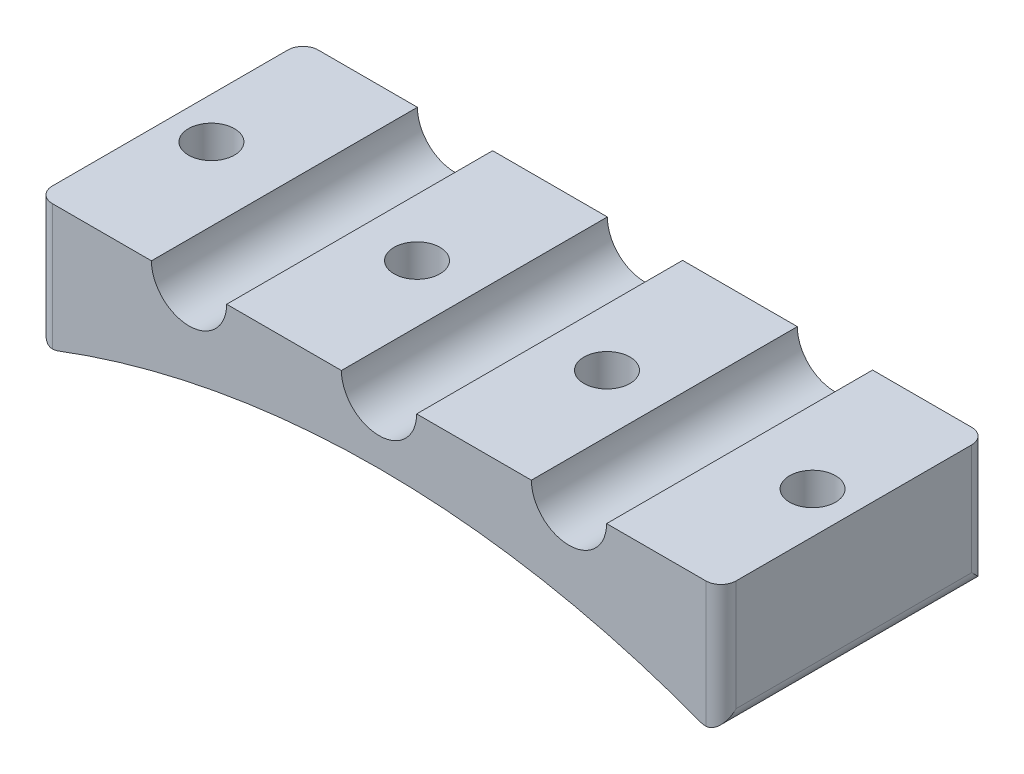
ISO-10303-21;
HEADER;
FILE_DESCRIPTION(('STEP AP214'),'2;1');
FILE_NAME('part.step','',(''),(''),'','','');
FILE_SCHEMA(('AUTOMOTIVE_DESIGN { 1 0 10303 214 1 1 1 1 }'));
ENDSEC;
DATA;
#1=APPLICATION_CONTEXT('core data for automotive mechanical design processes');
#2=APPLICATION_PROTOCOL_DEFINITION('international standard','automotive_design',2000,#1);
#3=PRODUCT_CONTEXT('',#1,'mechanical');
#4=PRODUCT('Part','Part','',(#3));
#5=PRODUCT_RELATED_PRODUCT_CATEGORY('part','',(#4));
#6=PRODUCT_DEFINITION_FORMATION('','',#4);
#7=PRODUCT_DEFINITION_CONTEXT('part definition',#1,'design');
#8=PRODUCT_DEFINITION('design','',#6,#7);
#9=PRODUCT_DEFINITION_SHAPE('','',#8);
#10=(LENGTH_UNIT() NAMED_UNIT(*) SI_UNIT(.MILLI.,.METRE.));
#11=(NAMED_UNIT(*) PLANE_ANGLE_UNIT() SI_UNIT($,.RADIAN.));
#12=(NAMED_UNIT(*) SI_UNIT($,.STERADIAN.) SOLID_ANGLE_UNIT());
#13=UNCERTAINTY_MEASURE_WITH_UNIT(LENGTH_MEASURE(1.E-05),#10,'distance_accuracy_value','');
#14=(GEOMETRIC_REPRESENTATION_CONTEXT(3) GLOBAL_UNCERTAINTY_ASSIGNED_CONTEXT((#13)) GLOBAL_UNIT_ASSIGNED_CONTEXT((#10,
#11,#12)) REPRESENTATION_CONTEXT('',''));
#15=CARTESIAN_POINT('',(0.,0.,0.));
#16=DIRECTION('',(0.,0.,1.));
#17=DIRECTION('',(1.,0.,0.));
#18=AXIS2_PLACEMENT_3D('',#15,#16,#17);
#19=CARTESIAN_POINT('',(0.,0.,0.));
#20=DIRECTION('',(0.,1.,0.));
#21=DIRECTION('',(0.,0.,1.));
#22=AXIS2_PLACEMENT_3D('',#19,#20,#21);
#23=PLANE('',#22);
#24=CARTESIAN_POINT('',(39.5552853917181,0.,17.5));
#25=DIRECTION('',(0.,1.,0.));
#26=DIRECTION('',(0.,0.,1.));
#27=AXIS2_PLACEMENT_3D('',#24,#25,#26);
#28=CIRCLE('',#27,3.025);
#29=CARTESIAN_POINT('',(39.5552853917181,0.,20.525));
#30=VERTEX_POINT('',#29);
#31=EDGE_CURVE('E280',#30,#30,#28,.T.);
#32=ORIENTED_EDGE('',*,*,#31,.F.);
#33=EDGE_LOOP('',(#32));
#34=FACE_BOUND('',#33,.T.);
#35=DIRECTION('',(0.,0.,1.));
#36=VECTOR('',#35,1.);
#37=CARTESIAN_POINT('',(45.,0.,35.));
#38=LINE('',#37,#36);
#39=CARTESIAN_POINT('',(45.,0.,2.));
#40=VERTEX_POINT('',#39);
#41=CARTESIAN_POINT('',(45.,0.,33.));
#42=VERTEX_POINT('',#41);
#43=EDGE_CURVE('E189',#40,#42,#38,.T.);
#44=ORIENTED_EDGE('',*,*,#43,.F.);
#45=CARTESIAN_POINT('',(43.,0.,2.));
#46=DIRECTION('',(0.,1.,0.));
#47=DIRECTION('',(0.,0.,1.));
#48=AXIS2_PLACEMENT_3D('',#45,#46,#47);
#49=CIRCLE('',#48,2.);
#50=CARTESIAN_POINT('',(43.,0.,0.));
#51=VERTEX_POINT('',#50);
#52=EDGE_CURVE('E166',#40,#51,#49,.T.);
#53=ORIENTED_EDGE('',*,*,#52,.T.);
#54=DIRECTION('',(-1.,0.,0.));
#55=VECTOR('',#54,1.);
#56=CARTESIAN_POINT('',(0.,0.,0.));
#57=LINE('',#56,#55);
#58=CARTESIAN_POINT('',(29.95,0.,0.));
#59=VERTEX_POINT('',#58);
#60=EDGE_CURVE('E158',#51,#59,#57,.T.);
#61=ORIENTED_EDGE('',*,*,#60,.T.);
#62=DIRECTION('',(0.,0.,-1.));
#63=VECTOR('',#62,1.);
#64=CARTESIAN_POINT('',(29.95,0.,35.));
#65=LINE('',#64,#63);
#66=CARTESIAN_POINT('',(29.95,0.,35.));
#67=VERTEX_POINT('',#66);
#68=EDGE_CURVE('E163',#67,#59,#65,.T.);
#69=ORIENTED_EDGE('',*,*,#68,.F.);
#70=DIRECTION('',(-1.,0.,0.));
#71=VECTOR('',#70,1.);
#72=CARTESIAN_POINT('',(0.,0.,35.));
#73=LINE('',#72,#71);
#74=CARTESIAN_POINT('',(43.,0.,35.));
#75=VERTEX_POINT('',#74);
#76=EDGE_CURVE('E290',#75,#67,#73,.T.);
#77=ORIENTED_EDGE('',*,*,#76,.F.);
#78=CARTESIAN_POINT('',(43.,0.,33.));
#79=DIRECTION('',(0.,1.,0.));
#80=DIRECTION('',(0.,0.,1.));
#81=AXIS2_PLACEMENT_3D('',#78,#79,#80);
#82=CIRCLE('',#81,2.);
#83=EDGE_CURVE('E247',#75,#42,#82,.T.);
#84=ORIENTED_EDGE('',*,*,#83,.T.);
#85=EDGE_LOOP('',(#44,#53,#61,#69,#77,#84));
#86=FACE_BOUND('',#85,.T.);
#87=ADVANCED_FACE('F45',(#34,#86),#23,.T.);
#88=CARTESIAN_POINT('',(12.5,0.,17.5));
#89=DIRECTION('',(0.,1.,0.));
#90=DIRECTION('',(0.,0.,1.));
#91=AXIS2_PLACEMENT_3D('',#88,#89,#90);
#92=CIRCLE('',#91,3.025);
#93=CARTESIAN_POINT('',(12.5,0.,20.525));
#94=VERTEX_POINT('',#93);
#95=EDGE_CURVE('E274',#94,#94,#92,.T.);
#96=ORIENTED_EDGE('',*,*,#95,.F.);
#97=EDGE_LOOP('',(#96));
#98=FACE_BOUND('',#97,.T.);
#99=CARTESIAN_POINT('',(20.05,0.,35.));
#100=VERTEX_POINT('',#99);
#101=CARTESIAN_POINT('',(4.95,0.,35.));
#102=VERTEX_POINT('',#101);
#103=EDGE_CURVE('E292',#100,#102,#73,.T.);
#104=ORIENTED_EDGE('',*,*,#103,.F.);
#105=DIRECTION('',(0.,0.,-1.));
#106=VECTOR('',#105,1.);
#107=CARTESIAN_POINT('',(20.05,0.,35.));
#108=LINE('',#107,#106);
#109=CARTESIAN_POINT('',(20.05,0.,0.));
#110=VERTEX_POINT('',#109);
#111=EDGE_CURVE('E186',#110,#100,#108,.F.);
#112=ORIENTED_EDGE('',*,*,#111,.F.);
#113=CARTESIAN_POINT('',(4.95,0.,0.));
#114=VERTEX_POINT('',#113);
#115=EDGE_CURVE('E170',#110,#114,#57,.T.);
#116=ORIENTED_EDGE('',*,*,#115,.T.);
#117=DIRECTION('',(0.,0.,-1.));
#118=VECTOR('',#117,1.);
#119=CARTESIAN_POINT('',(4.95,0.,35.));
#120=LINE('',#119,#118);
#121=EDGE_CURVE('E192',#102,#114,#120,.T.);
#122=ORIENTED_EDGE('',*,*,#121,.F.);
#123=EDGE_LOOP('',(#104,#112,#116,#122));
#124=FACE_BOUND('',#123,.T.);
#125=ADVANCED_FACE('F346',(#98,#124),#23,.T.);
#126=CARTESIAN_POINT('',(-12.5,0.,17.5));
#127=DIRECTION('',(0.,1.,0.));
#128=DIRECTION('',(0.,0.,1.));
#129=AXIS2_PLACEMENT_3D('',#126,#127,#128);
#130=CIRCLE('',#129,3.025);
#131=CARTESIAN_POINT('',(-12.5,0.,20.525));
#132=VERTEX_POINT('',#131);
#133=EDGE_CURVE('E266',#132,#132,#130,.T.);
#134=ORIENTED_EDGE('',*,*,#133,.F.);
#135=EDGE_LOOP('',(#134));
#136=FACE_BOUND('',#135,.T.);
#137=CARTESIAN_POINT('',(-4.94999999999999,0.,35.));
#138=VERTEX_POINT('',#137);
#139=CARTESIAN_POINT('',(-20.05,0.,35.));
#140=VERTEX_POINT('',#139);
#141=EDGE_CURVE('E341',#138,#140,#73,.T.);
#142=ORIENTED_EDGE('',*,*,#141,.F.);
#143=DIRECTION('',(0.,0.,-1.));
#144=VECTOR('',#143,1.);
#145=CARTESIAN_POINT('',(-4.94999999999999,0.,35.));
#146=LINE('',#145,#144);
#147=CARTESIAN_POINT('',(-4.94999999999999,0.,0.));
#148=VERTEX_POINT('',#147);
#149=EDGE_CURVE('E187',#148,#138,#146,.F.);
#150=ORIENTED_EDGE('',*,*,#149,.F.);
#151=CARTESIAN_POINT('',(-20.05,0.,0.));
#152=VERTEX_POINT('',#151);
#153=EDGE_CURVE('E201',#148,#152,#57,.T.);
#154=ORIENTED_EDGE('',*,*,#153,.T.);
#155=DIRECTION('',(0.,0.,-1.));
#156=VECTOR('',#155,1.);
#157=CARTESIAN_POINT('',(-20.05,0.,35.));
#158=LINE('',#157,#156);
#159=EDGE_CURVE('E296',#140,#152,#158,.T.);
#160=ORIENTED_EDGE('',*,*,#159,.F.);
#161=EDGE_LOOP('',(#142,#150,#154,#160));
#162=FACE_BOUND('',#161,.T.);
#163=ADVANCED_FACE('F353',(#136,#162),#23,.T.);
#164=CARTESIAN_POINT('',(-39.5552853917181,0.,17.5));
#165=DIRECTION('',(0.,1.,0.));
#166=DIRECTION('',(0.,0.,1.));
#167=AXIS2_PLACEMENT_3D('',#164,#165,#166);
#168=CIRCLE('',#167,3.025);
#169=CARTESIAN_POINT('',(-39.5552853917181,0.,20.525));
#170=VERTEX_POINT('',#169);
#171=EDGE_CURVE('E261',#170,#170,#168,.T.);
#172=ORIENTED_EDGE('',*,*,#171,.F.);
#173=EDGE_LOOP('',(#172));
#174=FACE_BOUND('',#173,.T.);
#175=CARTESIAN_POINT('',(-29.95,0.,0.));
#176=VERTEX_POINT('',#175);
#177=CARTESIAN_POINT('',(-43.,0.,0.));
#178=VERTEX_POINT('',#177);
#179=EDGE_CURVE('E172',#176,#178,#57,.T.);
#180=ORIENTED_EDGE('',*,*,#179,.T.);
#181=CARTESIAN_POINT('',(-43.,0.,2.));
#182=DIRECTION('',(0.,1.,0.));
#183=DIRECTION('',(0.,0.,1.));
#184=AXIS2_PLACEMENT_3D('',#181,#182,#183);
#185=CIRCLE('',#184,2.);
#186=CARTESIAN_POINT('',(-45.,0.,2.));
#187=VERTEX_POINT('',#186);
#188=EDGE_CURVE('E11',#178,#187,#185,.T.);
#189=ORIENTED_EDGE('',*,*,#188,.T.);
#190=DIRECTION('',(0.,0.,1.));
#191=VECTOR('',#190,1.);
#192=CARTESIAN_POINT('',(-45.,0.,35.));
#193=LINE('',#192,#191);
#194=CARTESIAN_POINT('',(-45.,0.,33.));
#195=VERTEX_POINT('',#194);
#196=EDGE_CURVE('E169',#187,#195,#193,.T.);
#197=ORIENTED_EDGE('',*,*,#196,.T.);
#198=CARTESIAN_POINT('',(-43.,0.,33.));
#199=DIRECTION('',(0.,1.,0.));
#200=DIRECTION('',(0.,0.,1.));
#201=AXIS2_PLACEMENT_3D('',#198,#199,#200);
#202=CIRCLE('',#201,2.);
#203=CARTESIAN_POINT('',(-43.,0.,35.));
#204=VERTEX_POINT('',#203);
#205=EDGE_CURVE('E54',#195,#204,#202,.T.);
#206=ORIENTED_EDGE('',*,*,#205,.T.);
#207=CARTESIAN_POINT('',(-29.95,0.,35.));
#208=VERTEX_POINT('',#207);
#209=EDGE_CURVE('E207',#208,#204,#73,.T.);
#210=ORIENTED_EDGE('',*,*,#209,.F.);
#211=DIRECTION('',(0.,0.,-1.));
#212=VECTOR('',#211,1.);
#213=CARTESIAN_POINT('',(-29.95,0.,35.));
#214=LINE('',#213,#212);
#215=EDGE_CURVE('E293',#176,#208,#214,.F.);
#216=ORIENTED_EDGE('',*,*,#215,.F.);
#217=EDGE_LOOP('',(#180,#189,#197,#206,#210,#216));
#218=FACE_BOUND('',#217,.T.);
#219=ADVANCED_FACE('F332',(#174,#218),#23,.T.);
#220=CARTESIAN_POINT('',(-45.,0.,35.));
#221=DIRECTION('',(1.,0.,0.));
#222=DIRECTION('',(0.,0.,-1.));
#223=AXIS2_PLACEMENT_3D('',#220,#221,#222);
#224=PLANE('',#223);
#225=ORIENTED_EDGE('',*,*,#196,.F.);
#226=DIRECTION('',(0.,-1.,0.));
#227=VECTOR('',#226,1.);
#228=CARTESIAN_POINT('',(-45.,0.,2.));
#229=LINE('',#228,#227);
#230=CARTESIAN_POINT('',(-45.,-14.565717740785,2.));
#231=VERTEX_POINT('',#230);
#232=EDGE_CURVE('E62',#187,#231,#229,.T.);
#233=ORIENTED_EDGE('',*,*,#232,.T.);
#234=DIRECTION('',(0.,0.,-1.));
#235=VECTOR('',#234,1.);
#236=CARTESIAN_POINT('',(-45.,-14.565717740785,35.));
#237=LINE('',#236,#235);
#238=CARTESIAN_POINT('',(-45.,-14.565717740785,33.));
#239=VERTEX_POINT('',#238);
#240=EDGE_CURVE('E66',#231,#239,#237,.F.);
#241=ORIENTED_EDGE('',*,*,#240,.T.);
#242=DIRECTION('',(0.,-1.,0.));
#243=VECTOR('',#242,1.);
#244=CARTESIAN_POINT('',(-45.,0.,33.));
#245=LINE('',#244,#243);
#246=EDGE_CURVE('E243',#239,#195,#245,.F.);
#247=ORIENTED_EDGE('',*,*,#246,.T.);
#248=EDGE_LOOP('',(#225,#233,#241,#247));
#249=FACE_BOUND('',#248,.T.);
#250=ADVANCED_FACE('F335',(#249),#224,.F.);
#251=CARTESIAN_POINT('',(0.,0.,35.));
#252=DIRECTION('',(0.,0.,-1.));
#253=DIRECTION('',(-1.,0.,0.));
#254=AXIS2_PLACEMENT_3D('',#251,#252,#253);
#255=CYLINDRICAL_SURFACE('',#254,4.95);
#256=CARTESIAN_POINT('',(0.,0.,35.));
#257=DIRECTION('',(0.,0.,1.));
#258=DIRECTION('',(1.,0.,0.));
#259=AXIS2_PLACEMENT_3D('',#256,#257,#258);
#260=CIRCLE('',#259,4.95);
#261=EDGE_CURVE('E206',#138,#102,#260,.T.);
#262=ORIENTED_EDGE('',*,*,#261,.T.);
#263=ORIENTED_EDGE('',*,*,#121,.T.);
#264=CARTESIAN_POINT('',(0.,0.,0.));
#265=DIRECTION('',(0.,0.,1.));
#266=DIRECTION('',(1.,0.,0.));
#267=AXIS2_PLACEMENT_3D('',#264,#265,#266);
#268=CIRCLE('',#267,4.95);
#269=EDGE_CURVE('E181',#148,#114,#268,.T.);
#270=ORIENTED_EDGE('',*,*,#269,.F.);
#271=ORIENTED_EDGE('',*,*,#149,.T.);
#272=EDGE_LOOP('',(#262,#263,#270,#271));
#273=FACE_BOUND('',#272,.T.);
#274=ADVANCED_FACE('F348',(#273),#255,.F.);
#275=CARTESIAN_POINT('',(25.,0.,35.));
#276=DIRECTION('',(0.,0.,-1.));
#277=DIRECTION('',(-1.,0.,0.));
#278=AXIS2_PLACEMENT_3D('',#275,#276,#277);
#279=CYLINDRICAL_SURFACE('',#278,4.95);
#280=CARTESIAN_POINT('',(25.,0.,35.));
#281=DIRECTION('',(0.,0.,1.));
#282=DIRECTION('',(1.,0.,0.));
#283=AXIS2_PLACEMENT_3D('',#280,#281,#282);
#284=CIRCLE('',#283,4.95);
#285=EDGE_CURVE('E185',#100,#67,#284,.T.);
#286=ORIENTED_EDGE('',*,*,#285,.T.);
#287=ORIENTED_EDGE('',*,*,#68,.T.);
#288=CARTESIAN_POINT('',(25.,0.,0.));
#289=DIRECTION('',(0.,0.,1.));
#290=DIRECTION('',(1.,0.,0.));
#291=AXIS2_PLACEMENT_3D('',#288,#289,#290);
#292=CIRCLE('',#291,4.95);
#293=EDGE_CURVE('E174',#110,#59,#292,.T.);
#294=ORIENTED_EDGE('',*,*,#293,.F.);
#295=ORIENTED_EDGE('',*,*,#111,.T.);
#296=EDGE_LOOP('',(#286,#287,#294,#295));
#297=FACE_BOUND('',#296,.T.);
#298=ADVANCED_FACE('F183',(#297),#279,.F.);
#299=CARTESIAN_POINT('',(45.,0.,35.));
#300=DIRECTION('',(1.,0.,0.));
#301=DIRECTION('',(0.,1.,0.));
#302=AXIS2_PLACEMENT_3D('',#299,#300,#301);
#303=PLANE('',#302);
#304=DIRECTION('',(0.,0.,1.));
#305=VECTOR('',#304,1.);
#306=CARTESIAN_POINT('',(45.,-14.565717740785,0.));
#307=LINE('',#306,#305);
#308=CARTESIAN_POINT('',(45.,-14.565717740785,33.));
#309=VERTEX_POINT('',#308);
#310=CARTESIAN_POINT('',(45.,-14.565717740785,2.));
#311=VERTEX_POINT('',#310);
#312=EDGE_CURVE('E217',#309,#311,#307,.F.);
#313=ORIENTED_EDGE('',*,*,#312,.T.);
#314=DIRECTION('',(0.,-1.,0.));
#315=VECTOR('',#314,1.);
#316=CARTESIAN_POINT('',(45.,0.,2.));
#317=LINE('',#316,#315);
#318=EDGE_CURVE('E220',#311,#40,#317,.F.);
#319=ORIENTED_EDGE('',*,*,#318,.T.);
#320=ORIENTED_EDGE('',*,*,#43,.T.);
#321=DIRECTION('',(0.,-1.,0.));
#322=VECTOR('',#321,1.);
#323=CARTESIAN_POINT('',(45.,0.,33.));
#324=LINE('',#323,#322);
#325=EDGE_CURVE('E215',#42,#309,#324,.T.);
#326=ORIENTED_EDGE('',*,*,#325,.T.);
#327=EDGE_LOOP('',(#313,#319,#320,#326));
#328=FACE_BOUND('',#327,.T.);
#329=ADVANCED_FACE('F301',(#328),#303,.T.);
#330=CARTESIAN_POINT('',(-25.,0.,35.));
#331=DIRECTION('',(0.,0.,-1.));
#332=DIRECTION('',(-1.,0.,0.));
#333=AXIS2_PLACEMENT_3D('',#330,#331,#332);
#334=CYLINDRICAL_SURFACE('',#333,4.95);
#335=CARTESIAN_POINT('',(-25.,0.,35.));
#336=DIRECTION('',(0.,0.,1.));
#337=DIRECTION('',(1.,0.,0.));
#338=AXIS2_PLACEMENT_3D('',#335,#336,#337);
#339=CIRCLE('',#338,4.95);
#340=EDGE_CURVE('E203',#208,#140,#339,.T.);
#341=ORIENTED_EDGE('',*,*,#340,.T.);
#342=ORIENTED_EDGE('',*,*,#159,.T.);
#343=CARTESIAN_POINT('',(-25.,0.,0.));
#344=DIRECTION('',(0.,0.,1.));
#345=DIRECTION('',(1.,0.,0.));
#346=AXIS2_PLACEMENT_3D('',#343,#344,#345);
#347=CIRCLE('',#346,4.95);
#348=EDGE_CURVE('E212',#176,#152,#347,.T.);
#349=ORIENTED_EDGE('',*,*,#348,.F.);
#350=ORIENTED_EDGE('',*,*,#215,.T.);
#351=EDGE_LOOP('',(#341,#342,#349,#350));
#352=FACE_BOUND('',#351,.T.);
#353=ADVANCED_FACE('F355',(#352),#334,.F.);
#354=CARTESIAN_POINT('',(0.,0.,35.));
#355=DIRECTION('',(0.,0.,1.));
#356=DIRECTION('',(1.,0.,0.));
#357=AXIS2_PLACEMENT_3D('',#354,#355,#356);
#358=PLANE('',#357);
#359=CARTESIAN_POINT('',(0.,-128.073886609814,35.));
#360=DIRECTION('',(0.,0.,1.));
#361=DIRECTION('',(1.,0.,0.));
#362=AXIS2_PLACEMENT_3D('',#359,#360,#361);
#363=CIRCLE('',#362,119.38);
#364=CARTESIAN_POINT('',(-42.2914812984017,-16.4360121693404,35.));
#365=VERTEX_POINT('',#364);
#366=CARTESIAN_POINT('',(42.2914812984017,-16.4360121693404,35.));
#367=VERTEX_POINT('',#366);
#368=EDGE_CURVE('E211',#365,#367,#363,.F.);
#369=ORIENTED_EDGE('',*,*,#368,.T.);
#370=CARTESIAN_POINT('',(43.,-14.565717740785,35.));
#371=DIRECTION('',(0.,0.,1.));
#372=DIRECTION('',(1.,0.,0.));
#373=AXIS2_PLACEMENT_3D('',#370,#371,#372);
#374=CIRCLE('',#373,2.);
#375=CARTESIAN_POINT('',(43.,-16.565717740785,35.));
#376=VERTEX_POINT('',#375);
#377=EDGE_CURVE('E241',#367,#376,#374,.T.);
#378=ORIENTED_EDGE('',*,*,#377,.T.);
#379=DIRECTION('',(0.,-1.,0.));
#380=VECTOR('',#379,1.);
#381=CARTESIAN_POINT('',(43.,0.,35.));
#382=LINE('',#381,#380);
#383=EDGE_CURVE('E239',#376,#75,#382,.F.);
#384=ORIENTED_EDGE('',*,*,#383,.T.);
#385=ORIENTED_EDGE('',*,*,#76,.T.);
#386=ORIENTED_EDGE('',*,*,#285,.F.);
#387=ORIENTED_EDGE('',*,*,#103,.T.);
#388=ORIENTED_EDGE('',*,*,#261,.F.);
#389=ORIENTED_EDGE('',*,*,#141,.T.);
#390=ORIENTED_EDGE('',*,*,#340,.F.);
#391=ORIENTED_EDGE('',*,*,#209,.T.);
#392=DIRECTION('',(0.,-1.,0.));
#393=VECTOR('',#392,1.);
#394=CARTESIAN_POINT('',(-43.,-17.5,35.));
#395=LINE('',#394,#393);
#396=CARTESIAN_POINT('',(-43.,-16.565717740785,35.));
#397=VERTEX_POINT('',#396);
#398=EDGE_CURVE('E235',#204,#397,#395,.T.);
#399=ORIENTED_EDGE('',*,*,#398,.T.);
#400=CARTESIAN_POINT('',(-43.,-14.565717740785,35.));
#401=DIRECTION('',(0.,0.,1.));
#402=DIRECTION('',(1.,0.,0.));
#403=AXIS2_PLACEMENT_3D('',#400,#401,#402);
#404=CIRCLE('',#403,2.);
#405=EDGE_CURVE('E237',#397,#365,#404,.T.);
#406=ORIENTED_EDGE('',*,*,#405,.T.);
#407=EDGE_LOOP('',(#369,#378,#384,#385,#386,#387,#388,#389,#390,#391,#399,#406));
#408=FACE_BOUND('',#407,.T.);
#409=ADVANCED_FACE('F323',(#408),#358,.T.);
#410=CARTESIAN_POINT('',(0.,0.,0.));
#411=DIRECTION('',(0.,0.,1.));
#412=DIRECTION('',(1.,0.,0.));
#413=AXIS2_PLACEMENT_3D('',#410,#411,#412);
#414=PLANE('',#413);
#415=DIRECTION('',(0.,-1.,0.));
#416=VECTOR('',#415,1.);
#417=CARTESIAN_POINT('',(43.,-17.5,0.));
#418=LINE('',#417,#416);
#419=CARTESIAN_POINT('',(43.,-16.565717740785,0.));
#420=VERTEX_POINT('',#419);
#421=EDGE_CURVE('E226',#51,#420,#418,.T.);
#422=ORIENTED_EDGE('',*,*,#421,.T.);
#423=CARTESIAN_POINT('',(43.,-14.565717740785,0.));
#424=DIRECTION('',(0.,0.,1.));
#425=DIRECTION('',(1.,0.,0.));
#426=AXIS2_PLACEMENT_3D('',#423,#424,#425);
#427=CIRCLE('',#426,2.);
#428=CARTESIAN_POINT('',(42.2914812984017,-16.4360121693404,0.));
#429=VERTEX_POINT('',#428);
#430=EDGE_CURVE('E228',#420,#429,#427,.F.);
#431=ORIENTED_EDGE('',*,*,#430,.T.);
#432=CARTESIAN_POINT('',(0.,-128.073886609814,0.));
#433=DIRECTION('',(0.,0.,1.));
#434=DIRECTION('',(1.,0.,0.));
#435=AXIS2_PLACEMENT_3D('',#432,#433,#434);
#436=CIRCLE('',#435,119.38);
#437=CARTESIAN_POINT('',(-42.2914812984017,-16.4360121693404,0.));
#438=VERTEX_POINT('',#437);
#439=EDGE_CURVE('E180',#438,#429,#436,.F.);
#440=ORIENTED_EDGE('',*,*,#439,.F.);
#441=CARTESIAN_POINT('',(-43.,-14.565717740785,0.));
#442=DIRECTION('',(0.,0.,1.));
#443=DIRECTION('',(1.,0.,0.));
#444=AXIS2_PLACEMENT_3D('',#441,#442,#443);
#445=CIRCLE('',#444,2.);
#446=CARTESIAN_POINT('',(-43.,-16.565717740785,0.));
#447=VERTEX_POINT('',#446);
#448=EDGE_CURVE('E224',#438,#447,#445,.F.);
#449=ORIENTED_EDGE('',*,*,#448,.T.);
#450=DIRECTION('',(0.,-1.,0.));
#451=VECTOR('',#450,1.);
#452=CARTESIAN_POINT('',(-43.,0.,0.));
#453=LINE('',#452,#451);
#454=EDGE_CURVE('E222',#447,#178,#453,.F.);
#455=ORIENTED_EDGE('',*,*,#454,.T.);
#456=ORIENTED_EDGE('',*,*,#179,.F.);
#457=ORIENTED_EDGE('',*,*,#348,.T.);
#458=ORIENTED_EDGE('',*,*,#153,.F.);
#459=ORIENTED_EDGE('',*,*,#269,.T.);
#460=ORIENTED_EDGE('',*,*,#115,.F.);
#461=ORIENTED_EDGE('',*,*,#293,.T.);
#462=ORIENTED_EDGE('',*,*,#60,.F.);
#463=EDGE_LOOP('',(#422,#431,#440,#449,#455,#456,#457,#458,#459,#460,#461,#462));
#464=FACE_BOUND('',#463,.T.);
#465=ADVANCED_FACE('F175',(#464),#414,.F.);
#466=CARTESIAN_POINT('',(0.,-128.073886609814,35.));
#467=DIRECTION('',(0.,0.,-1.));
#468=DIRECTION('',(-1.,0.,0.));
#469=AXIS2_PLACEMENT_3D('',#466,#467,#468);
#470=CYLINDRICAL_SURFACE('',#469,119.38);
#471=ORIENTED_EDGE('',*,*,#439,.T.);
#472=DIRECTION('',(0.,0.,-1.));
#473=VECTOR('',#472,1.);
#474=CARTESIAN_POINT('',(42.2914812984017,-16.4360121693404,35.));
#475=LINE('',#474,#473);
#476=EDGE_CURVE('E233',#429,#367,#475,.F.);
#477=ORIENTED_EDGE('',*,*,#476,.T.);
#478=ORIENTED_EDGE('',*,*,#368,.F.);
#479=DIRECTION('',(0.,0.,-1.));
#480=VECTOR('',#479,1.);
#481=CARTESIAN_POINT('',(-42.2914812984017,-16.4360121693404,35.));
#482=LINE('',#481,#480);
#483=EDGE_CURVE('E230',#365,#438,#482,.T.);
#484=ORIENTED_EDGE('',*,*,#483,.T.);
#485=EDGE_LOOP('',(#471,#477,#478,#484));
#486=FACE_BOUND('',#485,.T.);
#487=ADVANCED_FACE('F319',(#486),#470,.F.);
#488=CARTESIAN_POINT('',(43.,0.,33.));
#489=DIRECTION('',(0.,-1.,0.));
#490=DIRECTION('',(1.,0.,0.));
#491=AXIS2_PLACEMENT_3D('',#488,#489,#490);
#492=CYLINDRICAL_SURFACE('',#491,2.);
#493=ORIENTED_EDGE('',*,*,#83,.F.);
#494=ORIENTED_EDGE('',*,*,#383,.F.);
#495=CARTESIAN_POINT('',(43.,-14.565717740785,33.));
#496=DIRECTION('',(0.,-0.707106781186547,-0.707106781186547));
#497=DIRECTION('',(0.,-0.707106781186547,0.707106781186547));
#498=AXIS2_PLACEMENT_3D('',#495,#496,#497);
#499=ELLIPSE('',#498,2.82842712474619,2.);
#500=EDGE_CURVE('E202',#309,#376,#499,.T.);
#501=ORIENTED_EDGE('',*,*,#500,.F.);
#502=ORIENTED_EDGE('',*,*,#325,.F.);
#503=EDGE_LOOP('',(#493,#494,#501,#502));
#504=FACE_BOUND('',#503,.T.);
#505=ADVANCED_FACE('F306',(#504),#492,.T.);
#506=CARTESIAN_POINT('',(43.,0.,2.));
#507=DIRECTION('',(0.,1.,0.));
#508=DIRECTION('',(-1.,0.,0.));
#509=AXIS2_PLACEMENT_3D('',#506,#507,#508);
#510=CYLINDRICAL_SURFACE('',#509,2.);
#511=ORIENTED_EDGE('',*,*,#52,.F.);
#512=ORIENTED_EDGE('',*,*,#318,.F.);
#513=CARTESIAN_POINT('',(43.,-14.565717740785,2.));
#514=DIRECTION('',(0.,0.707106781186547,-0.707106781186547));
#515=DIRECTION('',(0.,0.707106781186547,0.707106781186547));
#516=AXIS2_PLACEMENT_3D('',#513,#514,#515);
#517=ELLIPSE('',#516,2.82842712474619,2.);
#518=EDGE_CURVE('E251',#420,#311,#517,.F.);
#519=ORIENTED_EDGE('',*,*,#518,.F.);
#520=ORIENTED_EDGE('',*,*,#421,.F.);
#521=EDGE_LOOP('',(#511,#512,#519,#520));
#522=FACE_BOUND('',#521,.T.);
#523=ADVANCED_FACE('F316',(#522),#510,.T.);
#524=CARTESIAN_POINT('',(43.,-14.565717740785,35.));
#525=DIRECTION('',(0.,0.,-1.));
#526=DIRECTION('',(-1.,0.,0.));
#527=AXIS2_PLACEMENT_3D('',#524,#525,#526);
#528=CYLINDRICAL_SURFACE('',#527,2.);
#529=ORIENTED_EDGE('',*,*,#377,.F.);
#530=ORIENTED_EDGE('',*,*,#476,.F.);
#531=ORIENTED_EDGE('',*,*,#430,.F.);
#532=ORIENTED_EDGE('',*,*,#518,.T.);
#533=ORIENTED_EDGE('',*,*,#312,.F.);
#534=ORIENTED_EDGE('',*,*,#500,.T.);
#535=EDGE_LOOP('',(#529,#530,#531,#532,#533,#534));
#536=FACE_BOUND('',#535,.T.);
#537=ADVANCED_FACE('F311',(#536),#528,.T.);
#538=CARTESIAN_POINT('',(-43.,0.,33.));
#539=DIRECTION('',(0.,1.,0.));
#540=DIRECTION('',(0.,0.,1.));
#541=AXIS2_PLACEMENT_3D('',#538,#539,#540);
#542=CYLINDRICAL_SURFACE('',#541,2.);
#543=ORIENTED_EDGE('',*,*,#205,.F.);
#544=ORIENTED_EDGE('',*,*,#246,.F.);
#545=CARTESIAN_POINT('',(-43.,-14.565717740785,33.));
#546=DIRECTION('',(0.,0.707106781186547,0.707106781186547));
#547=DIRECTION('',(0.,0.707106781186547,-0.707106781186547));
#548=AXIS2_PLACEMENT_3D('',#545,#546,#547);
#549=ELLIPSE('',#548,2.82842712474619,2.);
#550=EDGE_CURVE('E49',#397,#239,#549,.F.);
#551=ORIENTED_EDGE('',*,*,#550,.F.);
#552=ORIENTED_EDGE('',*,*,#398,.F.);
#553=EDGE_LOOP('',(#543,#544,#551,#552));
#554=FACE_BOUND('',#553,.T.);
#555=ADVANCED_FACE('F47',(#554),#542,.T.);
#556=CARTESIAN_POINT('',(-43.,0.,2.));
#557=DIRECTION('',(0.,-1.,0.));
#558=DIRECTION('',(0.,0.,-1.));
#559=AXIS2_PLACEMENT_3D('',#556,#557,#558);
#560=CYLINDRICAL_SURFACE('',#559,2.);
#561=ORIENTED_EDGE('',*,*,#188,.F.);
#562=ORIENTED_EDGE('',*,*,#454,.F.);
#563=CARTESIAN_POINT('',(-43.,-14.565717740785,2.));
#564=DIRECTION('',(0.,-0.707106781186547,0.707106781186547));
#565=DIRECTION('',(0.,-0.707106781186547,-0.707106781186547));
#566=AXIS2_PLACEMENT_3D('',#563,#564,#565);
#567=ELLIPSE('',#566,2.82842712474619,2.);
#568=EDGE_CURVE('E254',#231,#447,#567,.T.);
#569=ORIENTED_EDGE('',*,*,#568,.F.);
#570=ORIENTED_EDGE('',*,*,#232,.F.);
#571=EDGE_LOOP('',(#561,#562,#569,#570));
#572=FACE_BOUND('',#571,.T.);
#573=ADVANCED_FACE('F330',(#572),#560,.T.);
#574=CARTESIAN_POINT('',(-43.,-14.565717740785,35.));
#575=DIRECTION('',(0.,0.,-1.));
#576=DIRECTION('',(-1.,0.,0.));
#577=AXIS2_PLACEMENT_3D('',#574,#575,#576);
#578=CYLINDRICAL_SURFACE('',#577,2.);
#579=ORIENTED_EDGE('',*,*,#550,.T.);
#580=ORIENTED_EDGE('',*,*,#240,.F.);
#581=ORIENTED_EDGE('',*,*,#568,.T.);
#582=ORIENTED_EDGE('',*,*,#448,.F.);
#583=ORIENTED_EDGE('',*,*,#483,.F.);
#584=ORIENTED_EDGE('',*,*,#405,.F.);
#585=EDGE_LOOP('',(#579,#580,#581,#582,#583,#584));
#586=FACE_BOUND('',#585,.T.);
#587=ADVANCED_FACE('F325',(#586),#578,.T.);
#588=CARTESIAN_POINT('',(-39.5552853917181,-5.5,17.5));
#589=DIRECTION('',(0.,1.,0.));
#590=DIRECTION('',(0.,0.,1.));
#591=AXIS2_PLACEMENT_3D('',#588,#589,#590);
#592=CYLINDRICAL_SURFACE('',#591,3.025);
#593=CARTESIAN_POINT('',(-39.5552853917181,-5.5,17.5));
#594=DIRECTION('',(0.,1.,0.));
#595=DIRECTION('',(0.,0.,1.));
#596=AXIS2_PLACEMENT_3D('',#593,#594,#595);
#597=CIRCLE('',#596,3.025);
#598=CARTESIAN_POINT('',(-39.5552853917181,-5.5,20.525));
#599=VERTEX_POINT('',#598);
#600=EDGE_CURVE('E256',#599,#599,#597,.T.);
#601=ORIENTED_EDGE('',*,*,#600,.F.);
#602=EDGE_LOOP('',(#601));
#603=FACE_BOUND('',#602,.T.);
#604=ORIENTED_EDGE('',*,*,#171,.T.);
#605=EDGE_LOOP('',(#604));
#606=FACE_BOUND('',#605,.T.);
#607=ADVANCED_FACE('F406',(#603,#606),#592,.F.);
#608=CARTESIAN_POINT('',(-39.5552853917181,-5.5,17.5));
#609=DIRECTION('',(0.,1.,0.));
#610=DIRECTION('',(0.,0.,1.));
#611=AXIS2_PLACEMENT_3D('',#608,#609,#610);
#612=PLANE('',#611);
#613=ORIENTED_EDGE('',*,*,#600,.T.);
#614=EDGE_LOOP('',(#613));
#615=FACE_BOUND('',#614,.T.);
#616=ADVANCED_FACE('F404',(#615),#612,.T.);
#617=CARTESIAN_POINT('',(-12.5,-5.5,17.5));
#618=DIRECTION('',(0.,1.,0.));
#619=DIRECTION('',(0.,0.,1.));
#620=AXIS2_PLACEMENT_3D('',#617,#618,#619);
#621=CYLINDRICAL_SURFACE('',#620,3.025);
#622=CARTESIAN_POINT('',(-12.5,-5.5,17.5));
#623=DIRECTION('',(0.,1.,0.));
#624=DIRECTION('',(0.,0.,1.));
#625=AXIS2_PLACEMENT_3D('',#622,#623,#624);
#626=CIRCLE('',#625,3.025);
#627=CARTESIAN_POINT('',(-12.5,-5.5,20.525));
#628=VERTEX_POINT('',#627);
#629=EDGE_CURVE('E271',#628,#628,#626,.T.);
#630=ORIENTED_EDGE('',*,*,#629,.F.);
#631=EDGE_LOOP('',(#630));
#632=FACE_BOUND('',#631,.T.);
#633=ORIENTED_EDGE('',*,*,#133,.T.);
#634=EDGE_LOOP('',(#633));
#635=FACE_BOUND('',#634,.T.);
#636=ADVANCED_FACE('F400',(#632,#635),#621,.F.);
#637=CARTESIAN_POINT('',(-12.5,-5.5,17.5));
#638=DIRECTION('',(0.,1.,0.));
#639=DIRECTION('',(0.,0.,1.));
#640=AXIS2_PLACEMENT_3D('',#637,#638,#639);
#641=PLANE('',#640);
#642=ORIENTED_EDGE('',*,*,#629,.T.);
#643=EDGE_LOOP('',(#642));
#644=FACE_BOUND('',#643,.T.);
#645=ADVANCED_FACE('F396',(#644),#641,.T.);
#646=CARTESIAN_POINT('',(12.5,-5.5,17.5));
#647=DIRECTION('',(0.,1.,0.));
#648=DIRECTION('',(0.,0.,1.));
#649=AXIS2_PLACEMENT_3D('',#646,#647,#648);
#650=CYLINDRICAL_SURFACE('',#649,3.025);
#651=CARTESIAN_POINT('',(12.5,-5.5,17.5));
#652=DIRECTION('',(0.,1.,0.));
#653=DIRECTION('',(0.,0.,1.));
#654=AXIS2_PLACEMENT_3D('',#651,#652,#653);
#655=CIRCLE('',#654,3.025);
#656=CARTESIAN_POINT('',(12.5,-5.5,20.525));
#657=VERTEX_POINT('',#656);
#658=EDGE_CURVE('E277',#657,#657,#655,.T.);
#659=ORIENTED_EDGE('',*,*,#658,.F.);
#660=EDGE_LOOP('',(#659));
#661=FACE_BOUND('',#660,.T.);
#662=ORIENTED_EDGE('',*,*,#95,.T.);
#663=EDGE_LOOP('',(#662));
#664=FACE_BOUND('',#663,.T.);
#665=ADVANCED_FACE('F392',(#661,#664),#650,.F.);
#666=CARTESIAN_POINT('',(12.5,-5.5,17.5));
#667=DIRECTION('',(0.,1.,0.));
#668=DIRECTION('',(0.,0.,1.));
#669=AXIS2_PLACEMENT_3D('',#666,#667,#668);
#670=PLANE('',#669);
#671=ORIENTED_EDGE('',*,*,#658,.T.);
#672=EDGE_LOOP('',(#671));
#673=FACE_BOUND('',#672,.T.);
#674=ADVANCED_FACE('F388',(#673),#670,.T.);
#675=CARTESIAN_POINT('',(39.5552853917181,-5.5,17.5));
#676=DIRECTION('',(0.,1.,0.));
#677=DIRECTION('',(0.,0.,1.));
#678=AXIS2_PLACEMENT_3D('',#675,#676,#677);
#679=CYLINDRICAL_SURFACE('',#678,3.025);
#680=CARTESIAN_POINT('',(39.5552853917181,-5.5,17.5));
#681=DIRECTION('',(0.,1.,0.));
#682=DIRECTION('',(0.,0.,1.));
#683=AXIS2_PLACEMENT_3D('',#680,#681,#682);
#684=CIRCLE('',#683,3.025);
#685=CARTESIAN_POINT('',(39.5552853917181,-5.5,20.525));
#686=VERTEX_POINT('',#685);
#687=EDGE_CURVE('E283',#686,#686,#684,.T.);
#688=ORIENTED_EDGE('',*,*,#687,.F.);
#689=EDGE_LOOP('',(#688));
#690=FACE_BOUND('',#689,.T.);
#691=ORIENTED_EDGE('',*,*,#31,.T.);
#692=EDGE_LOOP('',(#691));
#693=FACE_BOUND('',#692,.T.);
#694=ADVANCED_FACE('F384',(#690,#693),#679,.F.);
#695=CARTESIAN_POINT('',(39.5552853917181,-5.5,17.5));
#696=DIRECTION('',(0.,1.,0.));
#697=DIRECTION('',(0.,0.,1.));
#698=AXIS2_PLACEMENT_3D('',#695,#696,#697);
#699=PLANE('',#698);
#700=ORIENTED_EDGE('',*,*,#687,.T.);
#701=EDGE_LOOP('',(#700));
#702=FACE_BOUND('',#701,.T.);
#703=ADVANCED_FACE('F381',(#702),#699,.T.);
#704=CLOSED_SHELL('',(#87,#125,#163,#219,#250,#274,#298,#329,#353,#409,#465,#487,#505,#523,#537,
#555,#573,#587,#607,#616,#636,#645,#665,#674,#694,#703));
#705=MANIFOLD_SOLID_BREP('B2',#704);
#706=ADVANCED_BREP_SHAPE_REPRESENTATION('',(#18,#705),#14);
#707=SHAPE_DEFINITION_REPRESENTATION(#9,#706);
ENDSEC;
END-ISO-10303-21;
